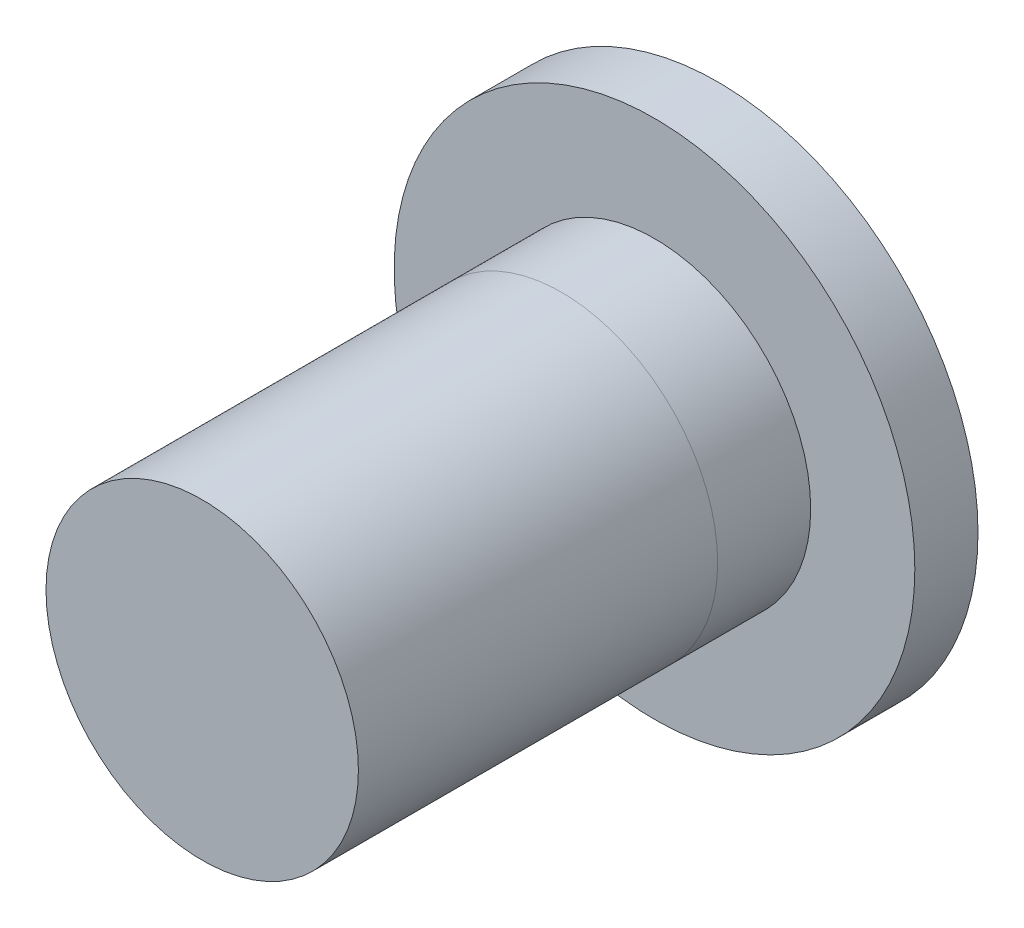
ISO-10303-21;
HEADER;
FILE_DESCRIPTION(('STEP AP214'),'2;1');
FILE_NAME('part.step','',(''),(''),'','','');
FILE_SCHEMA(('AUTOMOTIVE_DESIGN { 1 0 10303 214 1 1 1 1 }'));
ENDSEC;
DATA;
#1=APPLICATION_CONTEXT('core data for automotive mechanical design processes');
#2=APPLICATION_PROTOCOL_DEFINITION('international standard','automotive_design',2000,#1);
#3=PRODUCT_CONTEXT('',#1,'mechanical');
#4=PRODUCT('Part','Part','',(#3));
#5=PRODUCT_RELATED_PRODUCT_CATEGORY('part','',(#4));
#6=PRODUCT_DEFINITION_FORMATION('','',#4);
#7=PRODUCT_DEFINITION_CONTEXT('part definition',#1,'design');
#8=PRODUCT_DEFINITION('design','',#6,#7);
#9=PRODUCT_DEFINITION_SHAPE('','',#8);
#10=(LENGTH_UNIT() NAMED_UNIT(*) SI_UNIT(.MILLI.,.METRE.));
#11=(NAMED_UNIT(*) PLANE_ANGLE_UNIT() SI_UNIT($,.RADIAN.));
#12=(NAMED_UNIT(*) SI_UNIT($,.STERADIAN.) SOLID_ANGLE_UNIT());
#13=UNCERTAINTY_MEASURE_WITH_UNIT(LENGTH_MEASURE(1.E-05),#10,'distance_accuracy_value','');
#14=(GEOMETRIC_REPRESENTATION_CONTEXT(3) GLOBAL_UNCERTAINTY_ASSIGNED_CONTEXT((#13)) GLOBAL_UNIT_ASSIGNED_CONTEXT((#10,
#11,#12)) REPRESENTATION_CONTEXT('',''));
#15=CARTESIAN_POINT('',(0.,0.,0.));
#16=DIRECTION('',(0.,0.,1.));
#17=DIRECTION('',(1.,0.,0.));
#18=AXIS2_PLACEMENT_3D('',#15,#16,#17);
#19=CARTESIAN_POINT('',(-18.7680003805776,45.9999996825149,32.0606455966797));
#20=DIRECTION('',(0.,0.,-1.));
#21=DIRECTION('',(-1.,0.,0.));
#22=AXIS2_PLACEMENT_3D('',#19,#20,#21);
#23=CYLINDRICAL_SURFACE('',#22,10.);
#24=CARTESIAN_POINT('',(-18.7680003805776,45.9999996825149,1.));
#25=DIRECTION('',(0.,0.,1.));
#26=DIRECTION('',(1.,0.,0.));
#27=AXIS2_PLACEMENT_3D('',#24,#25,#26);
#28=CIRCLE('',#27,10.);
#29=CARTESIAN_POINT('',(-8.76800038057761,45.9999996825149,1.));
#30=VERTEX_POINT('',#29);
#31=EDGE_CURVE('E11',#30,#30,#28,.T.);
#32=ORIENTED_EDGE('',*,*,#31,.T.);
#33=EDGE_LOOP('',(#32));
#34=FACE_BOUND('',#33,.T.);
#35=CARTESIAN_POINT('',(-18.7680003499796,45.9999996825149,3.42637434921775));
#36=DIRECTION('',(-8.74227765734797E-08,0.,0.999999999999996));
#37=DIRECTION('',(0.999999999999996,0.,8.74227765734797E-08));
#38=AXIS2_PLACEMENT_3D('',#35,#36,#37);
#39=CIRCLE('',#38,10.);
#40=CARTESIAN_POINT('',(-8.76800034997967,45.9999996825149,3.42637522344552));
#41=VERTEX_POINT('',#40);
#42=EDGE_CURVE('E140',#41,#41,#39,.T.);
#43=ORIENTED_EDGE('',*,*,#42,.F.);
#44=EDGE_LOOP('',(#43));
#45=FACE_BOUND('',#44,.T.);
#46=ADVANCED_FACE('F37',(#34,#45),#23,.T.);
#47=CARTESIAN_POINT('',(-18.7680003805776,45.9999996825149,1.));
#48=DIRECTION('',(0.,0.,1.));
#49=DIRECTION('',(1.,0.,0.));
#50=AXIS2_PLACEMENT_3D('',#47,#48,#49);
#51=PLANE('',#50);
#52=ORIENTED_EDGE('',*,*,#31,.F.);
#53=EDGE_LOOP('',(#52));
#54=FACE_BOUND('',#53,.T.);
#55=CARTESIAN_POINT('',(-18.7680003805776,45.9999996825149,1.));
#56=DIRECTION('',(0.,0.,1.));
#57=DIRECTION('',(1.,0.,0.));
#58=AXIS2_PLACEMENT_3D('',#55,#56,#57);
#59=CIRCLE('',#58,4.5);
#60=CARTESIAN_POINT('',(-14.2680003805776,45.9999996825149,1.));
#61=VERTEX_POINT('',#60);
#62=EDGE_CURVE('E45',#61,#61,#59,.T.);
#63=ORIENTED_EDGE('',*,*,#62,.T.);
#64=EDGE_LOOP('',(#63));
#65=FACE_BOUND('',#64,.T.);
#66=ADVANCED_FACE('F108',(#54,#65),#51,.F.);
#67=CARTESIAN_POINT('',(-18.7680003805776,45.9999996825149,32.0606455966797));
#68=DIRECTION('',(0.,0.,-1.));
#69=DIRECTION('',(-1.,0.,0.));
#70=AXIS2_PLACEMENT_3D('',#67,#68,#69);
#71=CYLINDRICAL_SURFACE('',#70,4.5);
#72=ORIENTED_EDGE('',*,*,#62,.F.);
#73=EDGE_LOOP('',(#72));
#74=FACE_BOUND('',#73,.T.);
#75=CARTESIAN_POINT('',(-18.7680003805776,45.9999996825149,3.77637434921775));
#76=DIRECTION('',(-8.74227765734797E-08,0.,0.999999999999996));
#77=DIRECTION('',(0.999999999999996,0.,8.74227765734797E-08));
#78=AXIS2_PLACEMENT_3D('',#75,#76,#77);
#79=CIRCLE('',#78,4.50000000000001);
#80=CARTESIAN_POINT('',(-14.2680003805776,45.9999996825149,3.77637474262024));
#81=VERTEX_POINT('',#80);
#82=EDGE_CURVE('E97',#81,#81,#79,.T.);
#83=ORIENTED_EDGE('',*,*,#82,.T.);
#84=EDGE_LOOP('',(#83));
#85=FACE_BOUND('',#84,.T.);
#86=ADVANCED_FACE('F110',(#74,#85),#71,.F.);
#87=CARTESIAN_POINT('',(-18.7680021460096,45.9999996825148,23.9705627484769));
#88=DIRECTION('',(8.74227765734797E-08,0.,-0.999999999999996));
#89=DIRECTION('',(-0.999999999999996,0.,-8.74227765734797E-08));
#90=AXIS2_PLACEMENT_3D('',#87,#88,#89);
#91=CYLINDRICAL_SURFACE('',#90,4.50000000000001);
#92=CARTESIAN_POINT('',(-18.7680006623959,45.9999996825149,6.99999999999976));
#93=DIRECTION('',(0.,0.,-1.));
#94=DIRECTION('',(-1.,0.,0.));
#95=AXIS2_PLACEMENT_3D('',#92,#93,#94);
#96=CIRCLE('',#95,4.50000000000001);
#97=CARTESIAN_POINT('',(-23.2680006623959,45.9999996825149,6.99999999999976));
#98=VERTEX_POINT('',#97);
#99=EDGE_CURVE('E101',#98,#98,#96,.T.);
#100=ORIENTED_EDGE('',*,*,#99,.F.);
#101=EDGE_LOOP('',(#100));
#102=FACE_BOUND('',#101,.T.);
#103=ORIENTED_EDGE('',*,*,#82,.F.);
#104=EDGE_LOOP('',(#103));
#105=FACE_BOUND('',#104,.T.);
#106=ADVANCED_FACE('F113',(#102,#105),#91,.F.);
#107=CARTESIAN_POINT('',(-18.7680006623959,45.9999996825149,6.99999999999976));
#108=DIRECTION('',(0.,0.,1.));
#109=DIRECTION('',(1.,0.,0.));
#110=AXIS2_PLACEMENT_3D('',#107,#108,#109);
#111=PLANE('',#110);
#112=CARTESIAN_POINT('',(-18.7680003805776,45.9999996825149,6.99999999999976));
#113=DIRECTION('',(0.,0.,1.));
#114=DIRECTION('',(1.,0.,0.));
#115=AXIS2_PLACEMENT_3D('',#112,#113,#114);
#116=CIRCLE('',#115,3.5);
#117=CARTESIAN_POINT('',(-15.2680003805776,45.9999996825149,6.99999999999976));
#118=VERTEX_POINT('',#117);
#119=EDGE_CURVE('E84',#118,#118,#116,.T.);
#120=ORIENTED_EDGE('',*,*,#119,.T.);
#121=EDGE_LOOP('',(#120));
#122=FACE_BOUND('',#121,.T.);
#123=ORIENTED_EDGE('',*,*,#99,.T.);
#124=EDGE_LOOP('',(#123));
#125=FACE_BOUND('',#124,.T.);
#126=ADVANCED_FACE('F118',(#122,#125),#111,.F.);
#127=CARTESIAN_POINT('',(-18.7680003805776,45.9999996825149,27.6705627484774));
#128=DIRECTION('',(0.,0.,-1.));
#129=DIRECTION('',(-1.,0.,0.));
#130=AXIS2_PLACEMENT_3D('',#127,#128,#129);
#131=CYLINDRICAL_SURFACE('',#130,3.5);
#132=ORIENTED_EDGE('',*,*,#119,.F.);
#133=EDGE_LOOP('',(#132));
#134=FACE_BOUND('',#133,.T.);
#135=CARTESIAN_POINT('',(-18.7680003805776,45.9999996825149,10.4500000000003));
#136=DIRECTION('',(0.,0.,1.));
#137=DIRECTION('',(1.,0.,0.));
#138=AXIS2_PLACEMENT_3D('',#135,#136,#137);
#139=CIRCLE('',#138,3.5);
#140=CARTESIAN_POINT('',(-17.1006288116118,42.9226839608373,10.4500000000003));
#141=VERTEX_POINT('',#140);
#142=CARTESIAN_POINT('',(-17.1006290806393,49.0773155499783,10.4500000000003));
#143=VERTEX_POINT('',#142);
#144=EDGE_CURVE('E80',#141,#143,#139,.T.);
#145=ORIENTED_EDGE('',*,*,#144,.T.);
#146=DIRECTION('',(0.,0.,-1.));
#147=VECTOR('',#146,1.);
#148=CARTESIAN_POINT('',(-17.1006290806393,49.0773155499979,37.1705627484775));
#149=LINE('',#148,#147);
#150=CARTESIAN_POINT('',(-17.1006290806393,49.0773155499979,20.2000000000004));
#151=VERTEX_POINT('',#150);
#152=EDGE_CURVE('E59',#151,#143,#149,.T.);
#153=ORIENTED_EDGE('',*,*,#152,.F.);
#154=CARTESIAN_POINT('',(-18.7680003805776,45.9999996825345,20.2000000000004));
#155=DIRECTION('',(0.,0.,-1.));
#156=DIRECTION('',(0.,1.,0.));
#157=AXIS2_PLACEMENT_3D('',#154,#155,#156);
#158=CIRCLE('',#157,3.5);
#159=CARTESIAN_POINT('',(-17.1006288116118,42.9226839608373,20.2000000000004));
#160=VERTEX_POINT('',#159);
#161=EDGE_CURVE('E73',#160,#151,#158,.T.);
#162=ORIENTED_EDGE('',*,*,#161,.F.);
#163=DIRECTION('',(0.,0.,-1.));
#164=VECTOR('',#163,1.);
#165=CARTESIAN_POINT('',(-17.1006288116118,42.9226839608373,37.1705627484775));
#166=LINE('',#165,#164);
#167=EDGE_CURVE('E66',#160,#141,#166,.T.);
#168=ORIENTED_EDGE('',*,*,#167,.T.);
#169=EDGE_LOOP('',(#145,#153,#162,#168));
#170=FACE_BOUND('',#169,.T.);
#171=ADVANCED_FACE('F74',(#134,#170),#131,.F.);
#172=CARTESIAN_POINT('',(-18.7680006623959,45.9999996825149,10.4500000000003));
#173=DIRECTION('',(0.,0.,1.));
#174=DIRECTION('',(1.,0.,0.));
#175=AXIS2_PLACEMENT_3D('',#172,#173,#174);
#176=PLANE('',#175);
#177=ORIENTED_EDGE('',*,*,#144,.F.);
#178=DIRECTION('',(-4.37113905579743E-08,0.999999999999999,0.));
#179=VECTOR('',#178,1.);
#180=CARTESIAN_POINT('',(-17.1006290806393,49.0773155499979,10.4500000000003));
#181=LINE('',#180,#179);
#182=EDGE_CURVE('E51',#141,#143,#181,.T.);
#183=ORIENTED_EDGE('',*,*,#182,.T.);
#184=EDGE_LOOP('',(#177,#183));
#185=FACE_BOUND('',#184,.T.);
#186=ADVANCED_FACE('F167',(#185),#176,.F.);
#187=CARTESIAN_POINT('',(-17.1006290806393,49.0773155499979,37.1705627484775));
#188=DIRECTION('',(-0.999999999999999,-4.37113905579743E-08,0.));
#189=DIRECTION('',(4.37113905579743E-08,-0.999999999999999,0.));
#190=AXIS2_PLACEMENT_3D('',#187,#188,#189);
#191=PLANE('',#190);
#192=DIRECTION('',(4.37113905579743E-08,-0.999999999999999,0.));
#193=VECTOR('',#192,1.);
#194=CARTESIAN_POINT('',(-17.1006290806393,49.0773155499979,20.2000000000004));
#195=LINE('',#194,#193);
#196=EDGE_CURVE('E69',#151,#160,#195,.T.);
#197=ORIENTED_EDGE('',*,*,#196,.F.);
#198=ORIENTED_EDGE('',*,*,#152,.T.);
#199=ORIENTED_EDGE('',*,*,#182,.F.);
#200=ORIENTED_EDGE('',*,*,#167,.F.);
#201=EDGE_LOOP('',(#197,#198,#199,#200));
#202=FACE_BOUND('',#201,.T.);
#203=ADVANCED_FACE('F67',(#202),#191,.T.);
#204=CARTESIAN_POINT('',(-18.7680006623959,45.9999996825149,20.2000000000004));
#205=DIRECTION('',(0.,0.,1.));
#206=DIRECTION('',(1.,0.,0.));
#207=AXIS2_PLACEMENT_3D('',#204,#205,#206);
#208=PLANE('',#207);
#209=ORIENTED_EDGE('',*,*,#196,.T.);
#210=ORIENTED_EDGE('',*,*,#161,.T.);
#211=EDGE_LOOP('',(#209,#210));
#212=FACE_BOUND('',#211,.T.);
#213=ADVANCED_FACE('F78',(#212),#208,.F.);
#214=CARTESIAN_POINT('',(-18.7680003499796,45.9999996825149,3.42637434921775));
#215=DIRECTION('',(-8.74227765734797E-08,0.,0.999999999999996));
#216=DIRECTION('',(0.999999999999996,0.,8.74227765734797E-08));
#217=AXIS2_PLACEMENT_3D('',#214,#215,#216);
#218=PLANE('',#217);
#219=CARTESIAN_POINT('',(-18.7680003499797,45.9999996825149,3.42637434921775));
#220=DIRECTION('',(-8.74227765734797E-08,0.,0.999999999999996));
#221=DIRECTION('',(0.999999999999996,0.,8.74227765734797E-08));
#222=AXIS2_PLACEMENT_3D('',#219,#220,#221);
#223=CIRCLE('',#222,6.00000000000001);
#224=CARTESIAN_POINT('',(-12.7680003499797,45.9999996825149,3.42637487375441));
#225=VERTEX_POINT('',#224);
#226=EDGE_CURVE('E143',#225,#225,#223,.T.);
#227=ORIENTED_EDGE('',*,*,#226,.F.);
#228=EDGE_LOOP('',(#227));
#229=FACE_BOUND('',#228,.T.);
#230=ORIENTED_EDGE('',*,*,#42,.T.);
#231=EDGE_LOOP('',(#230));
#232=FACE_BOUND('',#231,.T.);
#233=ADVANCED_FACE('F153',(#229,#232),#218,.T.);
#234=CARTESIAN_POINT('',(-18.7680006623959,45.9999996825149,20.8000000000004));
#235=DIRECTION('',(0.,0.,1.));
#236=DIRECTION('',(1.,0.,0.));
#237=AXIS2_PLACEMENT_3D('',#234,#235,#236);
#238=PLANE('',#237);
#239=CARTESIAN_POINT('',(-18.7680006623959,45.9999996825149,20.8000000000004));
#240=DIRECTION('',(0.,0.,1.));
#241=DIRECTION('',(1.,0.,0.));
#242=AXIS2_PLACEMENT_3D('',#239,#240,#241);
#243=CIRCLE('',#242,6.);
#244=CARTESIAN_POINT('',(-12.7680006623959,45.9999996825149,20.8000000000004));
#245=VERTEX_POINT('',#244);
#246=EDGE_CURVE('E142',#245,#245,#243,.T.);
#247=ORIENTED_EDGE('',*,*,#246,.T.);
#248=EDGE_LOOP('',(#247));
#249=FACE_BOUND('',#248,.T.);
#250=ADVANCED_FACE('F155',(#249),#238,.T.);
#251=CARTESIAN_POINT('',(-18.7680006623959,45.9999996825149,27.6705627484774));
#252=DIRECTION('',(0.,0.,-1.));
#253=DIRECTION('',(-1.,0.,0.));
#254=AXIS2_PLACEMENT_3D('',#251,#252,#253);
#255=CYLINDRICAL_SURFACE('',#254,6.);
#256=CARTESIAN_POINT('',(-18.7680006623959,45.9999996825149,6.99999999999976));
#257=DIRECTION('',(0.,0.,1.));
#258=DIRECTION('',(1.,0.,0.));
#259=AXIS2_PLACEMENT_3D('',#256,#257,#258);
#260=CIRCLE('',#259,6.);
#261=CARTESIAN_POINT('',(-12.7680006623959,45.9999996825149,6.99999999999976));
#262=VERTEX_POINT('',#261);
#263=EDGE_CURVE('E94',#262,#262,#260,.T.);
#264=ORIENTED_EDGE('',*,*,#263,.T.);
#265=EDGE_LOOP('',(#264));
#266=FACE_BOUND('',#265,.T.);
#267=ORIENTED_EDGE('',*,*,#246,.F.);
#268=EDGE_LOOP('',(#267));
#269=FACE_BOUND('',#268,.T.);
#270=ADVANCED_FACE('F161',(#266,#269),#255,.T.);
#271=CARTESIAN_POINT('',(-18.7680021460096,45.9999996825148,23.9705627484769));
#272=DIRECTION('',(8.74227765734797E-08,0.,-0.999999999999996));
#273=DIRECTION('',(-0.999999999999996,0.,-8.74227765734797E-08));
#274=AXIS2_PLACEMENT_3D('',#271,#272,#273);
#275=CYLINDRICAL_SURFACE('',#274,6.);
#276=ORIENTED_EDGE('',*,*,#263,.F.);
#277=EDGE_LOOP('',(#276));
#278=FACE_BOUND('',#277,.T.);
#279=ORIENTED_EDGE('',*,*,#226,.T.);
#280=EDGE_LOOP('',(#279));
#281=FACE_BOUND('',#280,.T.);
#282=ADVANCED_FACE('F151',(#278,#281),#275,.T.);
#283=CLOSED_SHELL('',(#46,#66,#86,#106,#126,#171,#186,#203,#213,#233,#250,#270,#282));
#284=MANIFOLD_SOLID_BREP('B2',#283);
#285=ADVANCED_BREP_SHAPE_REPRESENTATION('',(#18,#284),#14);
#286=SHAPE_DEFINITION_REPRESENTATION(#9,#285);
ENDSEC;
END-ISO-10303-21;
